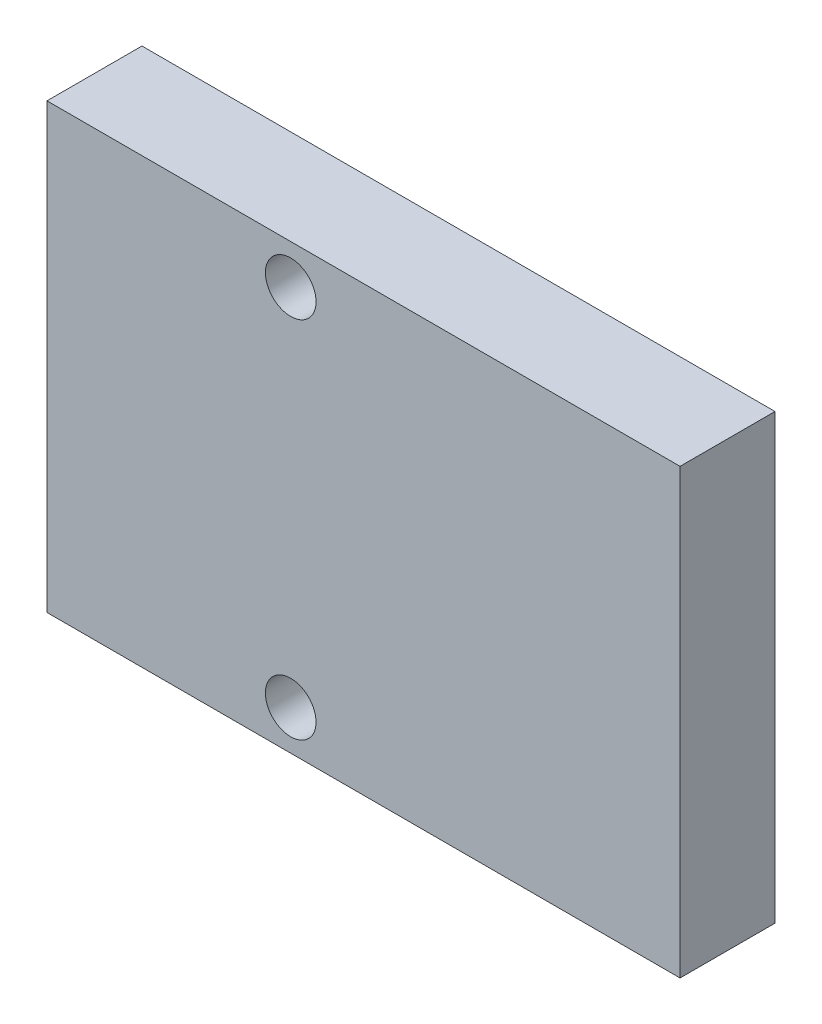
ISO-10303-21;
HEADER;
FILE_DESCRIPTION(('STEP AP214'),'2;1');
FILE_NAME('part.step','',(''),(''),'','','');
FILE_SCHEMA(('AUTOMOTIVE_DESIGN { 1 0 10303 214 1 1 1 1 }'));
ENDSEC;
DATA;
#1=APPLICATION_CONTEXT('core data for automotive mechanical design processes');
#2=APPLICATION_PROTOCOL_DEFINITION('international standard','automotive_design',2000,#1);
#3=PRODUCT_CONTEXT('',#1,'mechanical');
#4=PRODUCT('Part','Part','',(#3));
#5=PRODUCT_RELATED_PRODUCT_CATEGORY('part','',(#4));
#6=PRODUCT_DEFINITION_FORMATION('','',#4);
#7=PRODUCT_DEFINITION_CONTEXT('part definition',#1,'design');
#8=PRODUCT_DEFINITION('design','',#6,#7);
#9=PRODUCT_DEFINITION_SHAPE('','',#8);
#10=(LENGTH_UNIT() NAMED_UNIT(*) SI_UNIT(.MILLI.,.METRE.));
#11=(NAMED_UNIT(*) PLANE_ANGLE_UNIT() SI_UNIT($,.RADIAN.));
#12=(NAMED_UNIT(*) SI_UNIT($,.STERADIAN.) SOLID_ANGLE_UNIT());
#13=UNCERTAINTY_MEASURE_WITH_UNIT(LENGTH_MEASURE(1.E-05),#10,'distance_accuracy_value','');
#14=(GEOMETRIC_REPRESENTATION_CONTEXT(3) GLOBAL_UNCERTAINTY_ASSIGNED_CONTEXT((#13)) GLOBAL_UNIT_ASSIGNED_CONTEXT((#10,
#11,#12)) REPRESENTATION_CONTEXT('',''));
#15=CARTESIAN_POINT('',(0.,0.,0.));
#16=DIRECTION('',(0.,0.,1.));
#17=DIRECTION('',(1.,0.,0.));
#18=AXIS2_PLACEMENT_3D('',#15,#16,#17);
#19=CARTESIAN_POINT('',(0.,0.,6.));
#20=DIRECTION('',(-1.,0.,0.));
#21=DIRECTION('',(0.,0.,1.));
#22=AXIS2_PLACEMENT_3D('',#19,#20,#21);
#23=PLANE('',#22);
#24=DIRECTION('',(0.,1.,0.));
#25=VECTOR('',#24,1.);
#26=CARTESIAN_POINT('',(0.,0.,0.));
#27=LINE('',#26,#25);
#28=CARTESIAN_POINT('',(0.,0.,0.));
#29=VERTEX_POINT('',#28);
#30=CARTESIAN_POINT('',(0.,28.,0.));
#31=VERTEX_POINT('',#30);
#32=EDGE_CURVE('E96',#29,#31,#27,.T.);
#33=ORIENTED_EDGE('',*,*,#32,.T.);
#34=DIRECTION('',(0.,0.,-1.));
#35=VECTOR('',#34,1.);
#36=CARTESIAN_POINT('',(0.,28.,6.));
#37=LINE('',#36,#35);
#38=CARTESIAN_POINT('',(0.,28.,6.));
#39=VERTEX_POINT('',#38);
#40=EDGE_CURVE('E11',#39,#31,#37,.T.);
#41=ORIENTED_EDGE('',*,*,#40,.F.);
#42=DIRECTION('',(0.,1.,0.));
#43=VECTOR('',#42,1.);
#44=CARTESIAN_POINT('',(0.,0.,6.));
#45=LINE('',#44,#43);
#46=CARTESIAN_POINT('',(0.,0.,6.));
#47=VERTEX_POINT('',#46);
#48=EDGE_CURVE('E84',#47,#39,#45,.T.);
#49=ORIENTED_EDGE('',*,*,#48,.F.);
#50=DIRECTION('',(0.,0.,-1.));
#51=VECTOR('',#50,1.);
#52=CARTESIAN_POINT('',(0.,0.,6.));
#53=LINE('',#52,#51);
#54=EDGE_CURVE('E92',#47,#29,#53,.T.);
#55=ORIENTED_EDGE('',*,*,#54,.T.);
#56=EDGE_LOOP('',(#33,#41,#49,#55));
#57=FACE_BOUND('',#56,.T.);
#58=ADVANCED_FACE('F33',(#57),#23,.F.);
#59=CARTESIAN_POINT('',(0.,28.,6.));
#60=DIRECTION('',(0.,-1.,0.));
#61=DIRECTION('',(1.,0.,0.));
#62=AXIS2_PLACEMENT_3D('',#59,#60,#61);
#63=PLANE('',#62);
#64=DIRECTION('',(-1.,0.,0.));
#65=VECTOR('',#64,1.);
#66=CARTESIAN_POINT('',(0.,28.,0.));
#67=LINE('',#66,#65);
#68=CARTESIAN_POINT('',(-40.,28.,0.));
#69=VERTEX_POINT('',#68);
#70=EDGE_CURVE('E88',#31,#69,#67,.T.);
#71=ORIENTED_EDGE('',*,*,#70,.T.);
#72=DIRECTION('',(0.,0.,-1.));
#73=VECTOR('',#72,1.);
#74=CARTESIAN_POINT('',(-40.,28.,6.));
#75=LINE('',#74,#73);
#76=CARTESIAN_POINT('',(-40.,28.,6.));
#77=VERTEX_POINT('',#76);
#78=EDGE_CURVE('E41',#77,#69,#75,.T.);
#79=ORIENTED_EDGE('',*,*,#78,.F.);
#80=DIRECTION('',(-1.,0.,0.));
#81=VECTOR('',#80,1.);
#82=CARTESIAN_POINT('',(0.,28.,6.));
#83=LINE('',#82,#81);
#84=EDGE_CURVE('E79',#39,#77,#83,.T.);
#85=ORIENTED_EDGE('',*,*,#84,.F.);
#86=ORIENTED_EDGE('',*,*,#40,.T.);
#87=EDGE_LOOP('',(#71,#79,#85,#86));
#88=FACE_BOUND('',#87,.T.);
#89=ADVANCED_FACE('F87',(#88),#63,.F.);
#90=CARTESIAN_POINT('',(-40.,0.,6.));
#91=DIRECTION('',(1.,0.,0.));
#92=DIRECTION('',(0.,0.,-1.));
#93=AXIS2_PLACEMENT_3D('',#90,#91,#92);
#94=PLANE('',#93);
#95=DIRECTION('',(0.,-1.,0.));
#96=VECTOR('',#95,1.);
#97=CARTESIAN_POINT('',(-40.,0.,0.));
#98=LINE('',#97,#96);
#99=CARTESIAN_POINT('',(-40.,0.,0.));
#100=VERTEX_POINT('',#99);
#101=EDGE_CURVE('E66',#69,#100,#98,.T.);
#102=ORIENTED_EDGE('',*,*,#101,.T.);
#103=DIRECTION('',(0.,0.,-1.));
#104=VECTOR('',#103,1.);
#105=CARTESIAN_POINT('',(-40.,0.,6.));
#106=LINE('',#105,#104);
#107=CARTESIAN_POINT('',(-40.,0.,6.));
#108=VERTEX_POINT('',#107);
#109=EDGE_CURVE('E89',#108,#100,#106,.T.);
#110=ORIENTED_EDGE('',*,*,#109,.F.);
#111=DIRECTION('',(0.,-1.,0.));
#112=VECTOR('',#111,1.);
#113=CARTESIAN_POINT('',(-40.,0.,6.));
#114=LINE('',#113,#112);
#115=EDGE_CURVE('E82',#77,#108,#114,.T.);
#116=ORIENTED_EDGE('',*,*,#115,.F.);
#117=ORIENTED_EDGE('',*,*,#78,.T.);
#118=EDGE_LOOP('',(#102,#110,#116,#117));
#119=FACE_BOUND('',#118,.T.);
#120=ADVANCED_FACE('F90',(#119),#94,.F.);
#121=CARTESIAN_POINT('',(0.,0.,6.));
#122=DIRECTION('',(0.,1.,0.));
#123=DIRECTION('',(-1.,0.,0.));
#124=AXIS2_PLACEMENT_3D('',#121,#122,#123);
#125=PLANE('',#124);
#126=DIRECTION('',(1.,0.,0.));
#127=VECTOR('',#126,1.);
#128=CARTESIAN_POINT('',(0.,0.,0.));
#129=LINE('',#128,#127);
#130=EDGE_CURVE('E72',#100,#29,#129,.T.);
#131=ORIENTED_EDGE('',*,*,#130,.T.);
#132=ORIENTED_EDGE('',*,*,#54,.F.);
#133=DIRECTION('',(1.,0.,0.));
#134=VECTOR('',#133,1.);
#135=CARTESIAN_POINT('',(0.,0.,6.));
#136=LINE('',#135,#134);
#137=EDGE_CURVE('E49',#108,#47,#136,.T.);
#138=ORIENTED_EDGE('',*,*,#137,.F.);
#139=ORIENTED_EDGE('',*,*,#109,.T.);
#140=EDGE_LOOP('',(#131,#132,#138,#139));
#141=FACE_BOUND('',#140,.T.);
#142=ADVANCED_FACE('F104',(#141),#125,.F.);
#143=CARTESIAN_POINT('',(0.,0.,6.));
#144=DIRECTION('',(0.,0.,1.));
#145=DIRECTION('',(1.,0.,0.));
#146=AXIS2_PLACEMENT_3D('',#143,#144,#145);
#147=PLANE('',#146);
#148=CARTESIAN_POINT('',(-24.6,2.5,6.));
#149=DIRECTION('',(0.,0.,1.));
#150=DIRECTION('',(1.,0.,0.));
#151=AXIS2_PLACEMENT_3D('',#148,#149,#150);
#152=CIRCLE('',#151,1.6);
#153=CARTESIAN_POINT('',(-23.,2.5,6.));
#154=VERTEX_POINT('',#153);
#155=EDGE_CURVE('E115',#154,#154,#152,.T.);
#156=ORIENTED_EDGE('',*,*,#155,.F.);
#157=EDGE_LOOP('',(#156));
#158=FACE_BOUND('',#157,.T.);
#159=CARTESIAN_POINT('',(-24.6,25.5,6.));
#160=DIRECTION('',(0.,0.,1.));
#161=DIRECTION('',(1.,0.,0.));
#162=AXIS2_PLACEMENT_3D('',#159,#160,#161);
#163=CIRCLE('',#162,1.6);
#164=CARTESIAN_POINT('',(-23.,25.5,6.));
#165=VERTEX_POINT('',#164);
#166=EDGE_CURVE('E99',#165,#165,#163,.T.);
#167=ORIENTED_EDGE('',*,*,#166,.F.);
#168=EDGE_LOOP('',(#167));
#169=FACE_BOUND('',#168,.T.);
#170=ORIENTED_EDGE('',*,*,#48,.T.);
#171=ORIENTED_EDGE('',*,*,#84,.T.);
#172=ORIENTED_EDGE('',*,*,#115,.T.);
#173=ORIENTED_EDGE('',*,*,#137,.T.);
#174=EDGE_LOOP('',(#170,#171,#172,#173));
#175=FACE_BOUND('',#174,.T.);
#176=ADVANCED_FACE('F80',(#158,#169,#175),#147,.T.);
#177=CARTESIAN_POINT('',(0.,0.,0.));
#178=DIRECTION('',(0.,0.,1.));
#179=DIRECTION('',(1.,0.,0.));
#180=AXIS2_PLACEMENT_3D('',#177,#178,#179);
#181=PLANE('',#180);
#182=CARTESIAN_POINT('',(-24.6,2.5,0.));
#183=DIRECTION('',(0.,0.,-1.));
#184=DIRECTION('',(-1.,0.,0.));
#185=AXIS2_PLACEMENT_3D('',#182,#183,#184);
#186=CIRCLE('',#185,1.6);
#187=CARTESIAN_POINT('',(-26.2,2.5,0.));
#188=VERTEX_POINT('',#187);
#189=EDGE_CURVE('E118',#188,#188,#186,.T.);
#190=ORIENTED_EDGE('',*,*,#189,.F.);
#191=EDGE_LOOP('',(#190));
#192=FACE_BOUND('',#191,.T.);
#193=CARTESIAN_POINT('',(-24.6,25.5,0.));
#194=DIRECTION('',(0.,0.,-1.));
#195=DIRECTION('',(-1.,0.,0.));
#196=AXIS2_PLACEMENT_3D('',#193,#194,#195);
#197=CIRCLE('',#196,1.6);
#198=CARTESIAN_POINT('',(-26.2,25.5,0.));
#199=VERTEX_POINT('',#198);
#200=EDGE_CURVE('E112',#199,#199,#197,.T.);
#201=ORIENTED_EDGE('',*,*,#200,.F.);
#202=EDGE_LOOP('',(#201));
#203=FACE_BOUND('',#202,.T.);
#204=ORIENTED_EDGE('',*,*,#32,.F.);
#205=ORIENTED_EDGE('',*,*,#130,.F.);
#206=ORIENTED_EDGE('',*,*,#101,.F.);
#207=ORIENTED_EDGE('',*,*,#70,.F.);
#208=EDGE_LOOP('',(#204,#205,#206,#207));
#209=FACE_BOUND('',#208,.T.);
#210=ADVANCED_FACE('F107',(#192,#203,#209),#181,.F.);
#211=CARTESIAN_POINT('',(-24.6,25.5,10.));
#212=DIRECTION('',(0.,0.,-1.));
#213=DIRECTION('',(-1.,0.,0.));
#214=AXIS2_PLACEMENT_3D('',#211,#212,#213);
#215=CYLINDRICAL_SURFACE('',#214,1.6);
#216=ORIENTED_EDGE('',*,*,#166,.T.);
#217=EDGE_LOOP('',(#216));
#218=FACE_BOUND('',#217,.T.);
#219=ORIENTED_EDGE('',*,*,#200,.T.);
#220=EDGE_LOOP('',(#219));
#221=FACE_BOUND('',#220,.T.);
#222=ADVANCED_FACE('F126',(#218,#221),#215,.F.);
#223=CARTESIAN_POINT('',(-24.6,2.5,10.));
#224=DIRECTION('',(0.,0.,-1.));
#225=DIRECTION('',(-1.,0.,0.));
#226=AXIS2_PLACEMENT_3D('',#223,#224,#225);
#227=CYLINDRICAL_SURFACE('',#226,1.6);
#228=ORIENTED_EDGE('',*,*,#155,.T.);
#229=EDGE_LOOP('',(#228));
#230=FACE_BOUND('',#229,.T.);
#231=ORIENTED_EDGE('',*,*,#189,.T.);
#232=EDGE_LOOP('',(#231));
#233=FACE_BOUND('',#232,.T.);
#234=ADVANCED_FACE('F122',(#230,#233),#227,.F.);
#235=CLOSED_SHELL('',(#58,#89,#120,#142,#176,#210,#222,#234));
#236=MANIFOLD_SOLID_BREP('B2',#235);
#237=ADVANCED_BREP_SHAPE_REPRESENTATION('',(#18,#236),#14);
#238=SHAPE_DEFINITION_REPRESENTATION(#9,#237);
ENDSEC;
END-ISO-10303-21;
